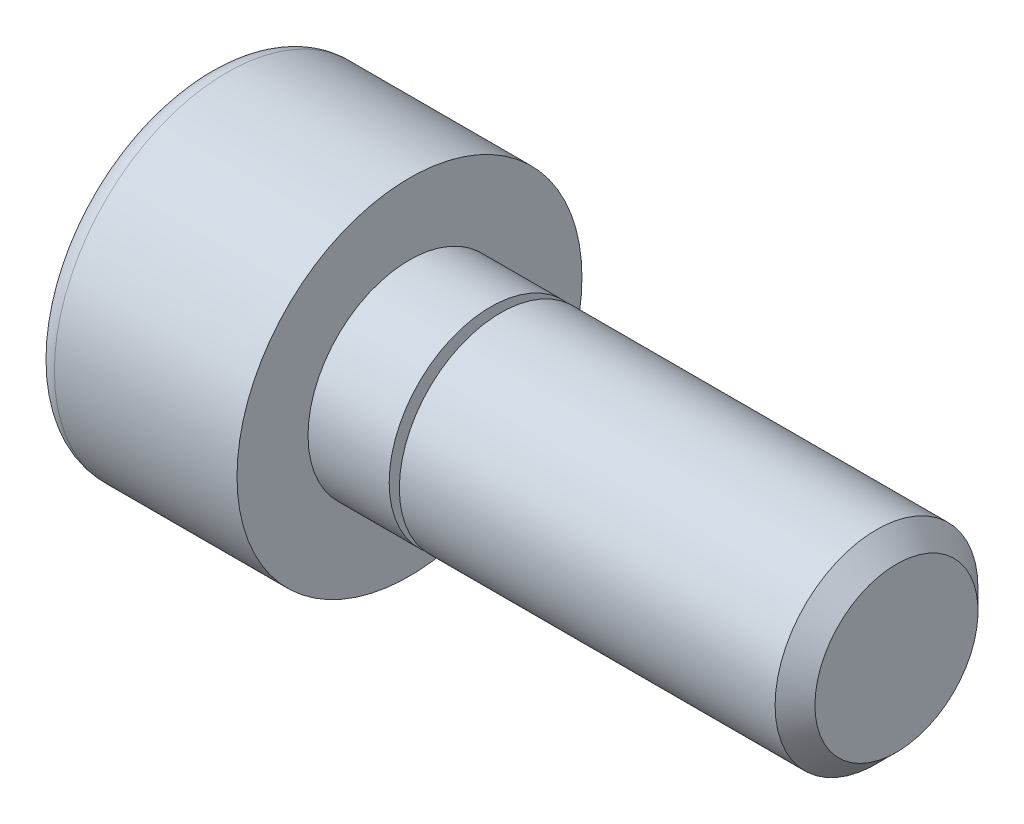
ISO-10303-21;
HEADER;
FILE_DESCRIPTION(('STEP AP214'),'2;1');
FILE_NAME('part.step','',(''),(''),'','','');
FILE_SCHEMA(('AUTOMOTIVE_DESIGN { 1 0 10303 214 1 1 1 1 }'));
ENDSEC;
DATA;
#1=APPLICATION_CONTEXT('core data for automotive mechanical design processes');
#2=APPLICATION_PROTOCOL_DEFINITION('international standard','automotive_design',2000,#1);
#3=PRODUCT_CONTEXT('',#1,'mechanical');
#4=PRODUCT('Part','Part','',(#3));
#5=PRODUCT_RELATED_PRODUCT_CATEGORY('part','',(#4));
#6=PRODUCT_DEFINITION_FORMATION('','',#4);
#7=PRODUCT_DEFINITION_CONTEXT('part definition',#1,'design');
#8=PRODUCT_DEFINITION('design','',#6,#7);
#9=PRODUCT_DEFINITION_SHAPE('','',#8);
#10=(LENGTH_UNIT() NAMED_UNIT(*) SI_UNIT(.MILLI.,.METRE.));
#11=(NAMED_UNIT(*) PLANE_ANGLE_UNIT() SI_UNIT($,.RADIAN.));
#12=(NAMED_UNIT(*) SI_UNIT($,.STERADIAN.) SOLID_ANGLE_UNIT());
#13=UNCERTAINTY_MEASURE_WITH_UNIT(LENGTH_MEASURE(1.E-05),#10,'distance_accuracy_value','');
#14=(GEOMETRIC_REPRESENTATION_CONTEXT(3) GLOBAL_UNCERTAINTY_ASSIGNED_CONTEXT((#13)) GLOBAL_UNIT_ASSIGNED_CONTEXT((#10,
#11,#12)) REPRESENTATION_CONTEXT('',''));
#15=CARTESIAN_POINT('',(0.,0.,0.));
#16=DIRECTION('',(0.,0.,1.));
#17=DIRECTION('',(1.,0.,0.));
#18=AXIS2_PLACEMENT_3D('',#15,#16,#17);
#19=CARTESIAN_POINT('',(-2.50800207641078,0.,0.));
#20=DIRECTION('',(-1.,0.,0.));
#21=DIRECTION('',(0.,0.,1.));
#22=AXIS2_PLACEMENT_3D('',#19,#20,#21);
#23=CONICAL_SURFACE('',#22,2.32385999953526,1.04719754991482);
#24=CARTESIAN_POINT('',(-1.16632087633661,0.,-1.13686837721616E-10));
#25=VERTEX_POINT('',#24);
#26=VERTEX_LOOP('',#25);
#27=FACE_BOUND('',#26,.T.);
#28=CARTESIAN_POINT('',(-2.50000000190923,8.72967523206108E-11,-2.30999999991681));
#29=CARTESIAN_POINT('',(-2.47069834508038,0.0879247130277353,-2.2592629528661));
#30=CARTESIAN_POINT('',(-2.44405218987991,0.176608409941901,-2.20808793331136));
#31=CARTESIAN_POINT('',(-2.39754710202349,0.355510589008526,-2.10485224477253));
#32=CARTESIAN_POINT('',(-2.37770461069812,0.44573224358922,-2.05278974513539));
#33=CARTESIAN_POINT('',(-2.34682514997627,0.625057743436692,-1.94930977889159));
#34=CARTESIAN_POINT('',(-2.33558252129551,0.714134040534282,-1.89790820898454));
#35=CARTESIAN_POINT('',(-2.32217544628159,0.892704520830334,-1.79486392756044));
#36=CARTESIAN_POINT('',(-2.31999988259922,0.982198057502897,-1.74322158912184));
#37=CARTESIAN_POINT('',(-2.32459182906118,1.14933877814961,-1.64677286239341));
#38=CARTESIAN_POINT('',(-2.33023188087448,1.22701132712599,-1.60195183720264));
#39=CARTESIAN_POINT('',(-2.34808703725041,1.38185053036963,-1.51260171388925));
#40=CARTESIAN_POINT('',(-2.36030820692843,1.45901665141116,-1.46807292346508));
#41=CARTESIAN_POINT('',(-2.3908521213403,1.61417359490342,-1.37853944781064));
#42=CARTESIAN_POINT('',(-2.40930399177252,1.69214483821185,-1.3335460607448));
#43=CARTESIAN_POINT('',(-2.45117938539502,1.84692621187759,-1.24422930804947));
#44=CARTESIAN_POINT('',(-2.47459310649739,1.92373831623652,-1.1999048033203));
#45=CARTESIAN_POINT('',(-2.50000000190403,1.99999999993875,-1.15589791940369));
#46=B_SPLINE_CURVE_WITH_KNOTS('',3,(#28,#29,#30,#31,#32,#33,#34,#35,#36,#37,#38,#39,#40,#41,#42,
#43,#44,#45),.UNSPECIFIED.,.F.,.F.,(4,2,2,2,2,2,2,2,4),(0.,0.317098327088295,0.634957622048133,
0.944954881170221,1.25457193307675,1.52387867958189,1.79343404325367,2.06895869071822,
2.34394403289926),.UNSPECIFIED.);
#47=CARTESIAN_POINT('',(-2.50000000196806,2.21089972947727E-11,-2.31000000003341));
#48=VERTEX_POINT('',#47);
#49=CARTESIAN_POINT('',(-2.50000000189895,1.99999999996912,-1.15589791933354));
#50=VERTEX_POINT('',#49);
#51=EDGE_CURVE('E86',#48,#50,#46,.T.);
#52=ORIENTED_EDGE('',*,*,#51,.F.);
#53=CARTESIAN_POINT('',(-2.50000000188539,-1.99999999991775,-1.15589791943219));
#54=CARTESIAN_POINT('',(-2.47069834507371,-1.91207528698015,-1.20663496649181));
#55=CARTESIAN_POINT('',(-2.44405218988045,-1.82339159006837,-1.2578099860495));
#56=CARTESIAN_POINT('',(-2.39754710202938,-1.64448941100589,-1.36104567458913));
#57=CARTESIAN_POINT('',(-2.37770461070214,-1.55426775642695,-1.41310817422408));
#58=CARTESIAN_POINT('',(-2.34682514997841,-1.37494225658268,-1.5165881404652));
#59=CARTESIAN_POINT('',(-2.33558252129765,-1.28586595948653,-1.56798971037172));
#60=CARTESIAN_POINT('',(-2.32217544628279,-1.10729547919339,-1.67103399179435));
#61=CARTESIAN_POINT('',(-2.31999988259948,-1.0178019425223,-1.72267633023203));
#62=CARTESIAN_POINT('',(-2.32459182905953,-0.850661221880082,-1.81912505695782));
#63=CARTESIAN_POINT('',(-2.33023188087171,-0.772988672906727,-1.86394608214686));
#64=CARTESIAN_POINT('',(-2.34808703724494,-0.618149469668993,-1.95329620545685));
#65=CARTESIAN_POINT('',(-2.36030820692141,-0.540983348630339,-1.99782499587935));
#66=CARTESIAN_POINT('',(-2.39085212132977,-0.38582640514412,-2.0873584715303));
#67=CARTESIAN_POINT('',(-2.40930399176002,-0.307855161838849,-2.13235185859433));
#68=CARTESIAN_POINT('',(-2.45117938537839,-0.15307378817938,-2.22166861128604));
#69=CARTESIAN_POINT('',(-2.47459310647857,-0.076261683823557,-2.26599311601341));
#70=CARTESIAN_POINT('',(-2.50000000188299,-1.24402203875345E-10,-2.30999999992825));
#71=B_SPLINE_CURVE_WITH_KNOTS('',3,(#53,#54,#55,#56,#57,#58,#59,#60,#61,#62,#63,#64,#65,#66,#67,
#68,#69,#70),.UNSPECIFIED.,.F.,.F.,(4,2,2,2,2,2,2,2,4),(0.,0.317098327081212,0.6349576220348,
0.944954881152187,1.25457193305368,1.52387867954816,1.79343404320945,2.06895869066211,
2.34394403283107),.UNSPECIFIED.);
#72=CARTESIAN_POINT('',(-2.50000000189879,-1.99999999995426,-1.15589791935874));
#73=VERTEX_POINT('',#72);
#74=EDGE_CURVE('E90',#73,#48,#71,.T.);
#75=ORIENTED_EDGE('',*,*,#74,.F.);
#76=CARTESIAN_POINT('',(-2.50000000188543,-2.00000000001426,1.15589791926553));
#77=CARTESIAN_POINT('',(-2.47066715817482,-2.00000000000513,1.05439351332403));
#78=CARTESIAN_POINT('',(-2.44398613642367,-2.00000000000138,0.952012968065246));
#79=CARTESIAN_POINT('',(-2.39740526180854,-1.99999999999863,0.74547758079383));
#80=CARTESIAN_POINT('',(-2.37752190290129,-1.99999999999964,0.641319058034691));
#81=CARTESIAN_POINT('',(-2.34655840389245,-2.00000000000036,0.434293404852367));
#82=CARTESIAN_POINT('',(-2.33527239148097,-2.0000000000001,0.331458201358285));
#83=CARTESIAN_POINT('',(-2.3217782265991,-1.99999999999991,0.125301798334307));
#84=CARTESIAN_POINT('',(-2.31955892203545,-1.99999999999998,0.0219813524365611));
#85=CARTESIAN_POINT('',(-2.32407859306614,-2.00000000000003,-0.171219623899702));
#86=CARTESIAN_POINT('',(-2.32970780719499,-2.00000000000001,-0.261128494068276));
#87=CARTESIAN_POINT('',(-2.34757937162094,-2.,-0.440360240108694));
#88=CARTESIAN_POINT('',(-2.35982787758643,-2.00000000000001,-0.52968249206609));
#89=CARTESIAN_POINT('',(-2.3904600973532,-2.00000000000001,-0.709286356050139));
#90=CARTESIAN_POINT('',(-2.40897417650058,-2.00000000000001,-0.799545136472541));
#91=CARTESIAN_POINT('',(-2.45099841984313,-2.00000000000001,-0.978713420507484));
#92=CARTESIAN_POINT('',(-2.47449865467731,-2.00000000000001,-1.06762523489312));
#93=CARTESIAN_POINT('',(-2.5000000019038,-2.00000000000001,-1.15589791929692));
#94=B_SPLINE_CURVE_WITH_KNOTS('',3,(#76,#77,#78,#79,#80,#81,#82,#83,#84,#85,#86,#87,#88,#89,#90,
#91,#92,#93),.UNSPECIFIED.,.F.,.F.,(4,2,2,2,2,2,2,2,4),(0.,0.317098023996062,0.634960087812836,
0.944948054846849,1.25455462021804,1.52455137224971,1.79479964328709,2.07105710712975,
2.34676951418342),.UNSPECIFIED.);
#95=CARTESIAN_POINT('',(-2.50000000189895,-1.99999999996913,1.15589791933348));
#96=VERTEX_POINT('',#95);
#97=EDGE_CURVE('E110',#96,#73,#94,.T.);
#98=ORIENTED_EDGE('',*,*,#97,.F.);
#99=CARTESIAN_POINT('',(-2.50000000189575,-1.14855030313734E-10,2.30999999991105));
#100=CARTESIAN_POINT('',(-2.47069834507116,-0.0879247130524016,2.25926295285548));
#101=CARTESIAN_POINT('',(-2.44405218987293,-0.176608409964879,2.20808793329903));
#102=CARTESIAN_POINT('',(-2.39754710201916,-0.355510589029194,2.10485224475956));
#103=CARTESIAN_POINT('',(-2.37770461069421,-0.445732243609269,2.05278974512351));
#104=CARTESIAN_POINT('',(-2.34682514997355,-0.625057743455291,1.94930977888106));
#105=CARTESIAN_POINT('',(-2.33558252129358,-0.714134040552059,1.8979082089743));
#106=CARTESIAN_POINT('',(-2.32217544628099,-0.892704520846473,1.79486392755101));
#107=CARTESIAN_POINT('',(-2.31999988259916,-0.982198057518221,1.74322158911292));
#108=CARTESIAN_POINT('',(-2.32459182906198,-1.14933877816293,1.64677286238568));
#109=CARTESIAN_POINT('',(-2.33023188087558,-1.22701132713814,1.60195183719558));
#110=CARTESIAN_POINT('',(-2.34808703725186,-1.38185053037944,1.51260171388353));
#111=CARTESIAN_POINT('',(-2.36030820692995,-1.4590166514198,1.46807292346004));
#112=CARTESIAN_POINT('',(-2.39085212134173,-1.61417359490964,1.378539447807));
#113=CARTESIAN_POINT('',(-2.40930399177378,-1.69214483821681,1.33354606074188));
#114=CARTESIAN_POINT('',(-2.45117938539578,-1.84692621188005,1.24422930804799));
#115=CARTESIAN_POINT('',(-2.4745931064978,-1.92373831623775,1.19990480331954));
#116=CARTESIAN_POINT('',(-2.50000000190404,-1.99999999993876,1.15589791940363));
#117=B_SPLINE_CURVE_WITH_KNOTS('',3,(#99,#100,#101,#102,#103,#104,#105,#106,#107,#108,#109,#110,
#111,#112,#113,#114,#115,#116),.UNSPECIFIED.,.F.,.F.,(4,2,2,2,2,2,2,2,4),(0.,0.317098327084848,
0.634957622041361,0.944954881160599,1.25457193306423,1.52387867956537,1.79343404323319,
2.06895869069338,2.34394403287003),.UNSPECIFIED.);
#118=CARTESIAN_POINT('',(-2.500000001964,-6.08522925275507E-11,2.31000000004159));
#119=VERTEX_POINT('',#118);
#120=EDGE_CURVE('E143',#119,#96,#117,.T.);
#121=ORIENTED_EDGE('',*,*,#120,.F.);
#122=CARTESIAN_POINT('',(-2.50000001424922,2.00000002037895,1.15589789982586));
#123=CARTESIAN_POINT('',(-2.47069835401467,1.91207530945518,1.20663495072141));
#124=CARTESIAN_POINT('',(-2.44405219693172,1.82339161292466,1.25780997210945));
#125=CARTESIAN_POINT('',(-2.39754710668336,1.64448943318172,1.361045662545));
#126=CARTESIAN_POINT('',(-2.37770461484991,1.5542677775379,1.41310816224113));
#127=CARTESIAN_POINT('',(-2.3468251528264,1.37494227601787,1.51658812905573));
#128=CARTESIAN_POINT('',(-2.33558252335131,1.28586597830375,1.56798969946136));
#129=CARTESIAN_POINT('',(-2.32217544695154,1.10729549660995,1.67103398179577));
#130=CARTESIAN_POINT('',(-2.31999988267852,1.01780195915629,1.72267632064626));
#131=CARTESIAN_POINT('',(-2.32459182819216,0.850661236439487,1.81912504854494));
#132=CARTESIAN_POINT('',(-2.33023187968358,0.772988686176712,1.86394607448628));
#133=CARTESIAN_POINT('',(-2.3480870356697,0.618149480359003,1.95329619929114));
#134=CARTESIAN_POINT('',(-2.36030820527958,0.540983358029749,1.99782499045622));
#135=CARTESIAN_POINT('',(-2.39085211979059,0.385826411878292,2.08735846764337));
#136=CARTESIAN_POINT('',(-2.40930399040108,0.307855167199837,2.13235185550024));
#137=CARTESIAN_POINT('',(-2.45117938457178,0.153073790823339,2.22166860976071));
#138=CARTESIAN_POINT('',(-2.47459310604415,0.0762616851236966,2.26599311526399));
#139=CARTESIAN_POINT('',(-2.50000000189075,1.01128367532092E-10,2.30999999994161));
#140=B_SPLINE_CURVE_WITH_KNOTS('',3,(#122,#123,#124,#125,#126,#127,#128,#129,#130,#131,#132,
#133,#134,#135,#136,#137,#138,#139),.UNSPECIFIED.,.F.,.F.,(4,2,2,2,2,2,2,2,4),(0.,
0.317098330198184,0.634957628187251,0.944954889933858,1.2545719445002,1.52387869539305,
1.79343406343802,2.06895871565029,2.34394406259438),.UNSPECIFIED.);
#141=CARTESIAN_POINT('',(-2.50000000145637,2.00000001238311,1.15589789632211));
#142=VERTEX_POINT('',#141);
#143=EDGE_CURVE('E150',#142,#119,#140,.T.);
#144=ORIENTED_EDGE('',*,*,#143,.F.);
#145=CARTESIAN_POINT('',(-2.50000000188542,2.00000000001424,-1.1558979192656));
#146=CARTESIAN_POINT('',(-2.47066715817775,2.00000000000511,-1.0543935133344));
#147=CARTESIAN_POINT('',(-2.44398613642905,2.00000000000136,-0.952012968086039));
#148=CARTESIAN_POINT('',(-2.39740526181758,1.99999999999862,-0.745477580837126));
#149=CARTESIAN_POINT('',(-2.37752190291144,1.99999999999963,-0.641319058090082));
#150=CARTESIAN_POINT('',(-2.34655840389916,2.00000000000035,-0.434293404909593));
#151=CARTESIAN_POINT('',(-2.33527239148492,2.00000000000009,-0.331458201404969));
#152=CARTESIAN_POINT('',(-2.32177822659974,1.9999999999999,-0.125301798357984));
#153=CARTESIAN_POINT('',(-2.31955892203562,1.99999999999997,-0.0219813524477697));
#154=CARTESIAN_POINT('',(-2.32407859300307,2.00000000000001,0.171219621220003));
#155=CARTESIAN_POINT('',(-2.32970780685849,2.,0.261128488713314));
#156=CARTESIAN_POINT('',(-2.3475793703602,1.99999999999999,0.440360229447717));
#157=CARTESIAN_POINT('',(-2.35982787567399,1.99999999999999,0.529682478774469));
#158=CARTESIAN_POINT('',(-2.3904600938155,1.99999999999999,0.709286337436137));
#159=CARTESIAN_POINT('',(-2.4089741719775,1.99999999999999,0.799545115169428));
#160=CARTESIAN_POINT('',(-2.45099841313512,1.99999999999999,0.978713393924246));
#161=CARTESIAN_POINT('',(-2.47449864677104,1.99999999999999,1.06762520571851));
#162=CARTESIAN_POINT('',(-2.49999999273716,1.99999999999999,1.15589788756732));
#163=B_SPLINE_CURVE_WITH_KNOTS('',3,(#145,#146,#147,#148,#149,#150,#151,#152,#153,#154,#155,
#156,#157,#158,#159,#160,#161,#162),.UNSPECIFIED.,.F.,.F.,(4,2,2,2,2,2,2,2,4),(0.,
0.317098023963984,0.634960087744522,0.94494805481117,1.25455462021802,1.52455136421273,
1.79479962718327,2.07105708253899,2.34676948117066),.UNSPECIFIED.);
#164=EDGE_CURVE('E93',#50,#142,#163,.T.);
#165=ORIENTED_EDGE('',*,*,#164,.F.);
#166=EDGE_LOOP('',(#52,#75,#98,#121,#144,#165));
#167=FACE_BOUND('',#166,.T.);
#168=ADVANCED_FACE('F18',(#27,#167),#23,.F.);
#169=CARTESIAN_POINT('',(-5.00000000000001,0.,-2.31000000000003));
#170=DIRECTION('',(0.,-0.499805607369878,0.86613760733594));
#171=DIRECTION('',(0.,-0.86613760733594,-0.499805607369878));
#172=AXIS2_PLACEMENT_3D('',#169,#170,#171);
#173=PLANE('',#172);
#174=ORIENTED_EDGE('',*,*,#51,.T.);
#175=DIRECTION('',(1.,0.,0.));
#176=VECTOR('',#175,1.);
#177=CARTESIAN_POINT('',(-5.,1.99999999999999,-1.15589791936835));
#178=LINE('',#177,#176);
#179=CARTESIAN_POINT('',(-5.00000000000001,1.99999999998248,-1.15589791938856));
#180=VERTEX_POINT('',#179);
#181=EDGE_CURVE('E96',#180,#50,#178,.T.);
#182=ORIENTED_EDGE('',*,*,#181,.F.);
#183=DIRECTION('',(0.,0.86613760733594,0.499805607369877));
#184=VECTOR('',#183,1.);
#185=CARTESIAN_POINT('',(-5.,0.,-2.31000000000003));
#186=LINE('',#185,#184);
#187=CARTESIAN_POINT('',(-5.,-1.05990303339576E-10,-2.30999999993888));
#188=VERTEX_POINT('',#187);
#189=EDGE_CURVE('E102',#188,#180,#186,.T.);
#190=ORIENTED_EDGE('',*,*,#189,.F.);
#191=DIRECTION('',(1.,0.,0.));
#192=VECTOR('',#191,1.);
#193=CARTESIAN_POINT('',(-5.,-1.05989869658707E-10,-2.30999999993888));
#194=LINE('',#193,#192);
#195=EDGE_CURVE('E99',#48,#188,#194,.F.);
#196=ORIENTED_EDGE('',*,*,#195,.F.);
#197=EDGE_LOOP('',(#174,#182,#190,#196));
#198=FACE_BOUND('',#197,.T.);
#199=ADVANCED_FACE('F100',(#198),#173,.T.);
#200=CARTESIAN_POINT('',(-5.,1.99999999999999,-1.15589791936835));
#201=DIRECTION('',(0.,-1.,0.));
#202=DIRECTION('',(0.,0.,-1.));
#203=AXIS2_PLACEMENT_3D('',#200,#201,#202);
#204=PLANE('',#203);
#205=DIRECTION('',(1.,0.,0.));
#206=VECTOR('',#205,1.);
#207=CARTESIAN_POINT('',(-5.00000000000003,1.99999999999999,1.15589791936829));
#208=LINE('',#207,#206);
#209=CARTESIAN_POINT('',(-5.,2.00000000560323,1.15589791613493));
#210=VERTEX_POINT('',#209);
#211=EDGE_CURVE('E155',#210,#142,#208,.T.);
#212=ORIENTED_EDGE('',*,*,#211,.F.);
#213=DIRECTION('',(0.,0.,1.));
#214=VECTOR('',#213,1.);
#215=CARTESIAN_POINT('',(-5.,1.99999999999999,0.));
#216=LINE('',#215,#214);
#217=EDGE_CURVE('E300',#180,#210,#216,.T.);
#218=ORIENTED_EDGE('',*,*,#217,.F.);
#219=ORIENTED_EDGE('',*,*,#181,.T.);
#220=ORIENTED_EDGE('',*,*,#164,.T.);
#221=EDGE_LOOP('',(#212,#218,#219,#220));
#222=FACE_BOUND('',#221,.T.);
#223=ADVANCED_FACE('F163',(#222),#204,.T.);
#224=CARTESIAN_POINT('',(-5.00000000000003,1.99999999999999,1.15589791936829));
#225=DIRECTION('',(0.,-0.499805607369878,-0.86613760733594));
#226=DIRECTION('',(0.,0.86613760733594,-0.499805607369878));
#227=AXIS2_PLACEMENT_3D('',#224,#225,#226);
#228=PLANE('',#227);
#229=ORIENTED_EDGE('',*,*,#143,.T.);
#230=DIRECTION('',(1.,0.,0.));
#231=VECTOR('',#230,1.);
#232=CARTESIAN_POINT('',(-5.00000000000001,0.,2.30999999999997));
#233=LINE('',#232,#231);
#234=CARTESIAN_POINT('',(-5.,1.3246655775675E-11,2.31000000000762));
#235=VERTEX_POINT('',#234);
#236=EDGE_CURVE('E149',#235,#119,#233,.T.);
#237=ORIENTED_EDGE('',*,*,#236,.F.);
#238=DIRECTION('',(0.,-0.866137607335941,0.499805607369876));
#239=VECTOR('',#238,1.);
#240=CARTESIAN_POINT('',(-5.,1.99999999999999,1.15589791936829));
#241=LINE('',#240,#239);
#242=EDGE_CURVE('E315',#210,#235,#241,.T.);
#243=ORIENTED_EDGE('',*,*,#242,.F.);
#244=ORIENTED_EDGE('',*,*,#211,.T.);
#245=EDGE_LOOP('',(#229,#237,#243,#244));
#246=FACE_BOUND('',#245,.T.);
#247=ADVANCED_FACE('F139',(#246),#228,.T.);
#248=CARTESIAN_POINT('',(-5.00000000000001,0.,2.30999999999997));
#249=DIRECTION('',(0.,0.499805607369878,-0.86613760733594));
#250=DIRECTION('',(0.,0.86613760733594,0.499805607369878));
#251=AXIS2_PLACEMENT_3D('',#248,#249,#250);
#252=PLANE('',#251);
#253=ORIENTED_EDGE('',*,*,#120,.T.);
#254=DIRECTION('',(1.,0.,0.));
#255=VECTOR('',#254,1.);
#256=CARTESIAN_POINT('',(-5.00000000000003,-2.00000000000001,1.15589791936829));
#257=LINE('',#256,#255);
#258=CARTESIAN_POINT('',(-5.,-2.00000000000001,1.15589791938344));
#259=VERTEX_POINT('',#258);
#260=EDGE_CURVE('E148',#259,#96,#257,.T.);
#261=ORIENTED_EDGE('',*,*,#260,.F.);
#262=DIRECTION('',(0.,-0.86613760733594,-0.499805607369879));
#263=VECTOR('',#262,1.);
#264=CARTESIAN_POINT('',(-5.,0.,2.30999999999997));
#265=LINE('',#264,#263);
#266=EDGE_CURVE('E310',#235,#259,#265,.T.);
#267=ORIENTED_EDGE('',*,*,#266,.F.);
#268=ORIENTED_EDGE('',*,*,#236,.T.);
#269=EDGE_LOOP('',(#253,#261,#267,#268));
#270=FACE_BOUND('',#269,.T.);
#271=ADVANCED_FACE('F134',(#270),#252,.T.);
#272=CARTESIAN_POINT('',(-5.00000000000003,-2.00000000000001,1.15589791936829));
#273=DIRECTION('',(0.,1.,0.));
#274=DIRECTION('',(0.,0.,1.));
#275=AXIS2_PLACEMENT_3D('',#272,#273,#274);
#276=PLANE('',#275);
#277=DIRECTION('',(1.,0.,0.));
#278=VECTOR('',#277,1.);
#279=CARTESIAN_POINT('',(-5.,-2.00000000000001,-1.15589791936835));
#280=LINE('',#279,#278);
#281=CARTESIAN_POINT('',(-5.,-2.0000000000133,-1.15589791936068));
#282=VERTEX_POINT('',#281);
#283=EDGE_CURVE('E108',#282,#73,#280,.T.);
#284=ORIENTED_EDGE('',*,*,#283,.F.);
#285=DIRECTION('',(0.,0.,1.));
#286=VECTOR('',#285,1.);
#287=CARTESIAN_POINT('',(-5.,-2.00000000000001,0.));
#288=LINE('',#287,#286);
#289=EDGE_CURVE('E305',#259,#282,#288,.F.);
#290=ORIENTED_EDGE('',*,*,#289,.F.);
#291=ORIENTED_EDGE('',*,*,#260,.T.);
#292=ORIENTED_EDGE('',*,*,#97,.T.);
#293=EDGE_LOOP('',(#284,#290,#291,#292));
#294=FACE_BOUND('',#293,.T.);
#295=ADVANCED_FACE('F129',(#294),#276,.T.);
#296=CARTESIAN_POINT('',(-5.,-2.00000000000001,-1.15589791936835));
#297=DIRECTION('',(0.,0.499805607369878,0.86613760733594));
#298=DIRECTION('',(0.,-0.86613760733594,0.499805607369878));
#299=AXIS2_PLACEMENT_3D('',#296,#297,#298);
#300=PLANE('',#299);
#301=ORIENTED_EDGE('',*,*,#74,.T.);
#302=ORIENTED_EDGE('',*,*,#195,.T.);
#303=DIRECTION('',(0.,0.86613760733594,-0.499805607369877));
#304=VECTOR('',#303,1.);
#305=CARTESIAN_POINT('',(-5.,-2.00000000000001,-1.15589791936835));
#306=LINE('',#305,#304);
#307=EDGE_CURVE('E303',#282,#188,#306,.T.);
#308=ORIENTED_EDGE('',*,*,#307,.F.);
#309=ORIENTED_EDGE('',*,*,#283,.T.);
#310=EDGE_LOOP('',(#301,#302,#308,#309));
#311=FACE_BOUND('',#310,.T.);
#312=ADVANCED_FACE('F107',(#311),#300,.T.);
#313=CARTESIAN_POINT('',(-5.,3.28000000000002,0.));
#314=DIRECTION('',(-1.,0.,0.));
#315=DIRECTION('',(0.,0.,1.));
#316=AXIS2_PLACEMENT_3D('',#313,#314,#315);
#317=PLANE('',#316);
#318=CARTESIAN_POINT('',(-5.,0.,0.));
#319=DIRECTION('',(1.,0.,0.));
#320=DIRECTION('',(0.,1.,0.));
#321=AXIS2_PLACEMENT_3D('',#318,#319,#320);
#322=CIRCLE('',#321,3.75000000000003);
#323=CARTESIAN_POINT('',(-5.,3.75000000000002,0.));
#324=VERTEX_POINT('',#323);
#325=CARTESIAN_POINT('',(-5.,0.,3.75));
#326=VERTEX_POINT('',#325);
#327=EDGE_CURVE('E243',#324,#326,#322,.T.);
#328=ORIENTED_EDGE('',*,*,#327,.F.);
#329=CARTESIAN_POINT('',(-5.,0.,0.));
#330=DIRECTION('',(1.,0.,0.));
#331=DIRECTION('',(0.,0.,-1.));
#332=AXIS2_PLACEMENT_3D('',#329,#330,#331);
#333=CIRCLE('',#332,3.75000000000003);
#334=CARTESIAN_POINT('',(-5.,0.,-3.75000000000006));
#335=VERTEX_POINT('',#334);
#336=EDGE_CURVE('E254',#335,#324,#333,.T.);
#337=ORIENTED_EDGE('',*,*,#336,.F.);
#338=CARTESIAN_POINT('',(-5.,0.,0.));
#339=DIRECTION('',(1.,0.,0.));
#340=DIRECTION('',(0.,-1.,0.));
#341=AXIS2_PLACEMENT_3D('',#338,#339,#340);
#342=CIRCLE('',#341,3.75000000000003);
#343=CARTESIAN_POINT('',(-5.,-3.75000000000004,0.));
#344=VERTEX_POINT('',#343);
#345=EDGE_CURVE('E39',#344,#335,#342,.T.);
#346=ORIENTED_EDGE('',*,*,#345,.F.);
#347=CARTESIAN_POINT('',(-5.,0.,0.));
#348=DIRECTION('',(1.,0.,0.));
#349=DIRECTION('',(0.,0.,1.));
#350=AXIS2_PLACEMENT_3D('',#347,#348,#349);
#351=CIRCLE('',#350,3.75000000000002);
#352=EDGE_CURVE('E232',#326,#344,#351,.T.);
#353=ORIENTED_EDGE('',*,*,#352,.F.);
#354=EDGE_LOOP('',(#328,#337,#346,#353));
#355=FACE_BOUND('',#354,.T.);
#356=ORIENTED_EDGE('',*,*,#289,.T.);
#357=ORIENTED_EDGE('',*,*,#307,.T.);
#358=ORIENTED_EDGE('',*,*,#189,.T.);
#359=ORIENTED_EDGE('',*,*,#217,.T.);
#360=ORIENTED_EDGE('',*,*,#242,.T.);
#361=ORIENTED_EDGE('',*,*,#266,.T.);
#362=EDGE_LOOP('',(#356,#357,#358,#359,#360,#361));
#363=FACE_BOUND('',#362,.T.);
#364=ADVANCED_FACE('F128',(#355,#363),#317,.T.);
#365=CARTESIAN_POINT('',(-4.5,0.,0.));
#366=DIRECTION('',(-1.,0.,0.));
#367=DIRECTION('',(0.,-1.,0.));
#368=AXIS2_PLACEMENT_3D('',#365,#366,#367);
#369=TOROIDAL_SURFACE('',#368,3.75000000000003,0.5);
#370=ORIENTED_EDGE('',*,*,#336,.T.);
#371=ORIENTED_EDGE('',*,*,#327,.T.);
#372=ORIENTED_EDGE('',*,*,#352,.T.);
#373=ORIENTED_EDGE('',*,*,#345,.T.);
#374=EDGE_LOOP('',(#370,#371,#372,#373));
#375=FACE_BOUND('',#374,.T.);
#376=CARTESIAN_POINT('',(-4.5,0.,0.));
#377=DIRECTION('',(-1.,0.,0.));
#378=DIRECTION('',(0.,0.,1.));
#379=AXIS2_PLACEMENT_3D('',#376,#377,#378);
#380=CIRCLE('',#379,4.25000000000003);
#381=CARTESIAN_POINT('',(-4.5,0.,4.25000000000001));
#382=VERTEX_POINT('',#381);
#383=EDGE_CURVE('E219',#382,#382,#380,.F.);
#384=ORIENTED_EDGE('',*,*,#383,.F.);
#385=EDGE_LOOP('',(#384));
#386=FACE_BOUND('',#385,.T.);
#387=ADVANCED_FACE('F208',(#375,#386),#369,.T.);
#388=CARTESIAN_POINT('',(-2.50000000000003,0.,0.));
#389=DIRECTION('',(-1.,0.,0.));
#390=DIRECTION('',(0.,0.,1.));
#391=AXIS2_PLACEMENT_3D('',#388,#389,#390);
#392=CYLINDRICAL_SURFACE('',#391,4.25000000000003);
#393=ORIENTED_EDGE('',*,*,#383,.T.);
#394=EDGE_LOOP('',(#393));
#395=FACE_BOUND('',#394,.T.);
#396=CARTESIAN_POINT('',(0.,0.,0.));
#397=DIRECTION('',(-1.,0.,0.));
#398=DIRECTION('',(0.,0.,1.));
#399=AXIS2_PLACEMENT_3D('',#396,#397,#398);
#400=CIRCLE('',#399,4.25000000000003);
#401=CARTESIAN_POINT('',(0.,0.,4.25000000000001));
#402=VERTEX_POINT('',#401);
#403=EDGE_CURVE('E118',#402,#402,#400,.F.);
#404=ORIENTED_EDGE('',*,*,#403,.F.);
#405=EDGE_LOOP('',(#404));
#406=FACE_BOUND('',#405,.T.);
#407=ADVANCED_FACE('F205',(#395,#406),#392,.T.);
#408=CARTESIAN_POINT('',(0.,3.37499999999999,0.));
#409=DIRECTION('',(1.,0.,0.));
#410=DIRECTION('',(0.,0.,-1.));
#411=AXIS2_PLACEMENT_3D('',#408,#409,#410);
#412=PLANE('',#411);
#413=ORIENTED_EDGE('',*,*,#403,.T.);
#414=EDGE_LOOP('',(#413));
#415=FACE_BOUND('',#414,.T.);
#416=CARTESIAN_POINT('',(0.,0.,0.));
#417=DIRECTION('',(-1.,0.,0.));
#418=DIRECTION('',(0.,0.,1.));
#419=AXIS2_PLACEMENT_3D('',#416,#417,#418);
#420=CIRCLE('',#419,2.5);
#421=CARTESIAN_POINT('',(0.,0.,2.49999999999996));
#422=VERTEX_POINT('',#421);
#423=EDGE_CURVE('E334',#422,#422,#420,.F.);
#424=ORIENTED_EDGE('',*,*,#423,.F.);
#425=EDGE_LOOP('',(#424));
#426=FACE_BOUND('',#425,.T.);
#427=ADVANCED_FACE('F201',(#415,#426),#412,.T.);
#428=CARTESIAN_POINT('',(0.754619999999974,0.,0.));
#429=DIRECTION('',(-1.,0.,0.));
#430=DIRECTION('',(0.,0.,1.));
#431=AXIS2_PLACEMENT_3D('',#428,#429,#430);
#432=CYLINDRICAL_SURFACE('',#431,2.5);
#433=ORIENTED_EDGE('',*,*,#423,.T.);
#434=EDGE_LOOP('',(#433));
#435=FACE_BOUND('',#434,.T.);
#436=CARTESIAN_POINT('',(2.,0.,0.));
#437=DIRECTION('',(-1.,0.,0.));
#438=DIRECTION('',(0.,0.,1.));
#439=AXIS2_PLACEMENT_3D('',#436,#437,#438);
#440=CIRCLE('',#439,2.5);
#441=CARTESIAN_POINT('',(2.,0.,2.49999999999996));
#442=VERTEX_POINT('',#441);
#443=EDGE_CURVE('E332',#442,#442,#440,.T.);
#444=ORIENTED_EDGE('',*,*,#443,.T.);
#445=EDGE_LOOP('',(#444));
#446=FACE_BOUND('',#445,.T.);
#447=ADVANCED_FACE('F197',(#435,#446),#432,.T.);
#448=CARTESIAN_POINT('',(12.,1.00462000000001,0.));
#449=DIRECTION('',(1.,0.,0.));
#450=DIRECTION('',(0.,0.,-1.));
#451=AXIS2_PLACEMENT_3D('',#448,#449,#450);
#452=PLANE('',#451);
#453=CARTESIAN_POINT('',(12.0000000002847,0.,0.));
#454=DIRECTION('',(-1.,0.,0.));
#455=DIRECTION('',(0.,0.,1.));
#456=AXIS2_PLACEMENT_3D('',#453,#454,#455);
#457=CIRCLE('',#456,2.00924000023408);
#458=CARTESIAN_POINT('',(12.0000000002847,0.,2.00924000023406));
#459=VERTEX_POINT('',#458);
#460=EDGE_CURVE('E329',#459,#459,#457,.T.);
#461=ORIENTED_EDGE('',*,*,#460,.F.);
#462=EDGE_LOOP('',(#461));
#463=FACE_BOUND('',#462,.T.);
#464=ADVANCED_FACE('F193',(#463),#452,.T.);
#465=CARTESIAN_POINT('',(2.,2.28344364905387,0.));
#466=DIRECTION('',(-1.,0.,0.));
#467=DIRECTION('',(0.,0.,1.));
#468=AXIS2_PLACEMENT_3D('',#465,#466,#467);
#469=PLANE('',#468);
#470=ORIENTED_EDGE('',*,*,#443,.F.);
#471=EDGE_LOOP('',(#470));
#472=FACE_BOUND('',#471,.T.);
#473=CARTESIAN_POINT('',(1.99999999974294,0.,0.));
#474=DIRECTION('',(1.,0.,0.));
#475=DIRECTION('',(0.,0.,-1.));
#476=AXIS2_PLACEMENT_3D('',#473,#474,#475);
#477=CIRCLE('',#476,2.06688729826965);
#478=CARTESIAN_POINT('',(1.99999999974294,0.,-2.06688729826968));
#479=VERTEX_POINT('',#478);
#480=EDGE_CURVE('E326',#479,#479,#477,.T.);
#481=ORIENTED_EDGE('',*,*,#480,.F.);
#482=EDGE_LOOP('',(#481));
#483=FACE_BOUND('',#482,.T.);
#484=ADVANCED_FACE('F189',(#472,#483),#469,.F.);
#485=CARTESIAN_POINT('',(11.5092400000663,0.,0.));
#486=DIRECTION('',(-1.,0.,0.));
#487=DIRECTION('',(0.,0.,1.));
#488=AXIS2_PLACEMENT_3D('',#485,#486,#487);
#489=CONICAL_SURFACE('',#488,2.499999999543,0.78539816247083);
#490=CARTESIAN_POINT('',(11.5092399999999,0.,0.));
#491=DIRECTION('',(-1.,0.,0.));
#492=DIRECTION('',(0.,0.,1.));
#493=AXIS2_PLACEMENT_3D('',#490,#491,#492);
#494=CIRCLE('',#493,2.5);
#495=CARTESIAN_POINT('',(11.5092399999999,0.,2.49999999999996));
#496=VERTEX_POINT('',#495);
#497=EDGE_CURVE('E30',#496,#496,#494,.T.);
#498=ORIENTED_EDGE('',*,*,#497,.F.);
#499=EDGE_LOOP('',(#498));
#500=FACE_BOUND('',#499,.T.);
#501=ORIENTED_EDGE('',*,*,#460,.T.);
#502=EDGE_LOOP('',(#501));
#503=FACE_BOUND('',#502,.T.);
#504=ADVANCED_FACE('F182',(#500,#503),#489,.T.);
#505=CARTESIAN_POINT('',(2.25005773484099,0.,0.));
#506=DIRECTION('',(1.,0.,0.));
#507=DIRECTION('',(0.,0.,-1.));
#508=AXIS2_PLACEMENT_3D('',#505,#506,#507);
#509=CONICAL_SURFACE('',#508,2.4999999990882,1.04719754999999);
#510=CARTESIAN_POINT('',(2.25005773502687,0.,0.));
#511=DIRECTION('',(-1.,0.,0.));
#512=DIRECTION('',(0.,0.,1.));
#513=AXIS2_PLACEMENT_3D('',#510,#511,#512);
#514=CIRCLE('',#513,2.5);
#515=CARTESIAN_POINT('',(2.25005773502687,0.,2.49999999999996));
#516=VERTEX_POINT('',#515);
#517=EDGE_CURVE('E11',#516,#516,#514,.F.);
#518=ORIENTED_EDGE('',*,*,#517,.F.);
#519=EDGE_LOOP('',(#518));
#520=FACE_BOUND('',#519,.T.);
#521=ORIENTED_EDGE('',*,*,#480,.T.);
#522=EDGE_LOOP('',(#521));
#523=FACE_BOUND('',#522,.T.);
#524=ADVANCED_FACE('F176',(#520,#523),#509,.T.);
#525=CARTESIAN_POINT('',(0.754619999999974,0.,0.));
#526=DIRECTION('',(-1.,0.,0.));
#527=DIRECTION('',(0.,0.,1.));
#528=AXIS2_PLACEMENT_3D('',#525,#526,#527);
#529=CYLINDRICAL_SURFACE('',#528,2.5);
#530=ORIENTED_EDGE('',*,*,#517,.T.);
#531=EDGE_LOOP('',(#530));
#532=FACE_BOUND('',#531,.T.);
#533=ORIENTED_EDGE('',*,*,#497,.T.);
#534=EDGE_LOOP('',(#533));
#535=FACE_BOUND('',#534,.T.);
#536=ADVANCED_FACE('F174',(#532,#535),#529,.T.);
#537=CLOSED_SHELL('',(#168,#199,#223,#247,#271,#295,#312,#364,#387,#407,#427,#447,#464,#484,
#504,#524,#536));
#538=MANIFOLD_SOLID_BREP('B1',#537);
#539=ADVANCED_BREP_SHAPE_REPRESENTATION('',(#18,#538),#14);
#540=SHAPE_DEFINITION_REPRESENTATION(#9,#539);
ENDSEC;
END-ISO-10303-21;
